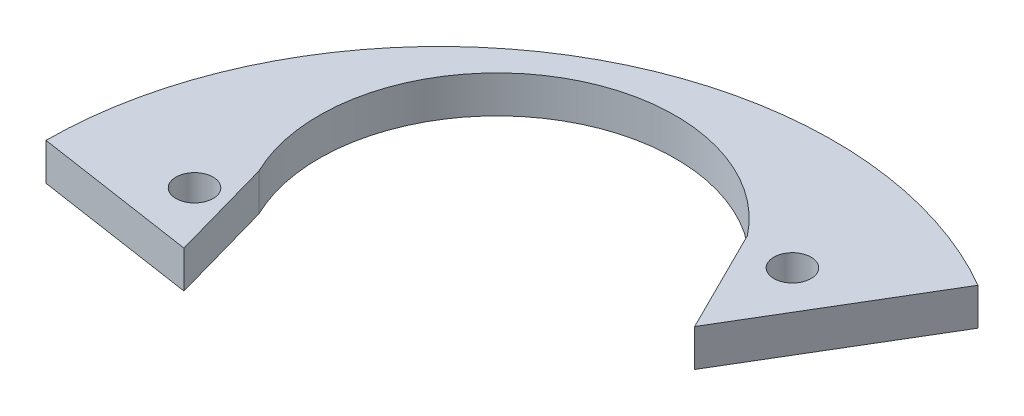
ISO-10303-21;
HEADER;
FILE_DESCRIPTION(('STEP AP214'),'2;1');
FILE_NAME('part.step','',(''),(''),'','','');
FILE_SCHEMA(('AUTOMOTIVE_DESIGN { 1 0 10303 214 1 1 1 1 }'));
ENDSEC;
DATA;
#1=APPLICATION_CONTEXT('core data for automotive mechanical design processes');
#2=APPLICATION_PROTOCOL_DEFINITION('international standard','automotive_design',2000,#1);
#3=PRODUCT_CONTEXT('',#1,'mechanical');
#4=PRODUCT('Part','Part','',(#3));
#5=PRODUCT_RELATED_PRODUCT_CATEGORY('part','',(#4));
#6=PRODUCT_DEFINITION_FORMATION('','',#4);
#7=PRODUCT_DEFINITION_CONTEXT('part definition',#1,'design');
#8=PRODUCT_DEFINITION('design','',#6,#7);
#9=PRODUCT_DEFINITION_SHAPE('','',#8);
#10=(LENGTH_UNIT() NAMED_UNIT(*) SI_UNIT(.MILLI.,.METRE.));
#11=(NAMED_UNIT(*) PLANE_ANGLE_UNIT() SI_UNIT($,.RADIAN.));
#12=(NAMED_UNIT(*) SI_UNIT($,.STERADIAN.) SOLID_ANGLE_UNIT());
#13=UNCERTAINTY_MEASURE_WITH_UNIT(LENGTH_MEASURE(1.E-05),#10,'distance_accuracy_value','');
#14=(GEOMETRIC_REPRESENTATION_CONTEXT(3) GLOBAL_UNCERTAINTY_ASSIGNED_CONTEXT((#13)) GLOBAL_UNIT_ASSIGNED_CONTEXT((#10,
#11,#12)) REPRESENTATION_CONTEXT('',''));
#15=CARTESIAN_POINT('',(0.,0.,0.));
#16=DIRECTION('',(0.,0.,1.));
#17=DIRECTION('',(1.,0.,0.));
#18=AXIS2_PLACEMENT_3D('',#15,#16,#17);
#19=CARTESIAN_POINT('',(-8.98202615056909,3.,4.86257778184173));
#20=DIRECTION('',(0.,-1.,0.));
#21=DIRECTION('',(0.,0.,-1.));
#22=AXIS2_PLACEMENT_3D('',#19,#20,#21);
#23=CYLINDRICAL_SURFACE('',#22,14.3707592623544);
#24=CARTESIAN_POINT('',(-8.98202615056909,0.,4.86257778184173));
#25=DIRECTION('',(0.,1.,0.));
#26=DIRECTION('',(0.,0.,1.));
#27=AXIS2_PLACEMENT_3D('',#24,#25,#26);
#28=CIRCLE('',#27,14.3707592623544);
#29=CARTESIAN_POINT('',(2.3104080282445,0.,-4.02559706419421));
#30=VERTEX_POINT('',#29);
#31=CARTESIAN_POINT('',(-21.9045801751569,0.,11.1495738259118));
#32=VERTEX_POINT('',#31);
#33=EDGE_CURVE('E128',#30,#32,#28,.T.);
#34=ORIENTED_EDGE('',*,*,#33,.F.);
#35=DIRECTION('',(0.,-1.,0.));
#36=VECTOR('',#35,1.);
#37=CARTESIAN_POINT('',(2.3104080282445,3.,-4.02559706419421));
#38=LINE('',#37,#36);
#39=CARTESIAN_POINT('',(2.3104080282445,3.,-4.02559706419421));
#40=VERTEX_POINT('',#39);
#41=EDGE_CURVE('E11',#40,#30,#38,.T.);
#42=ORIENTED_EDGE('',*,*,#41,.F.);
#43=CARTESIAN_POINT('',(-8.98202615056909,3.,4.86257778184173));
#44=DIRECTION('',(0.,1.,0.));
#45=DIRECTION('',(0.,0.,1.));
#46=AXIS2_PLACEMENT_3D('',#43,#44,#45);
#47=CIRCLE('',#46,14.3707592623544);
#48=CARTESIAN_POINT('',(-21.9045801751569,3.,11.1495738259118));
#49=VERTEX_POINT('',#48);
#50=EDGE_CURVE('E185',#40,#49,#47,.T.);
#51=ORIENTED_EDGE('',*,*,#50,.T.);
#52=DIRECTION('',(0.,-1.,0.));
#53=VECTOR('',#52,1.);
#54=CARTESIAN_POINT('',(-21.9045801751569,3.,11.1495738259118));
#55=LINE('',#54,#53);
#56=EDGE_CURVE('E78',#49,#32,#55,.T.);
#57=ORIENTED_EDGE('',*,*,#56,.T.);
#58=EDGE_LOOP('',(#34,#42,#51,#57));
#59=FACE_BOUND('',#58,.T.);
#60=ADVANCED_FACE('F33',(#59),#23,.F.);
#61=CARTESIAN_POINT('',(3.45753328539834,3.,-1.72102092555103));
#62=DIRECTION('',(0.895227963513024,0.,-0.445608452954299));
#63=DIRECTION('',(-0.445608452954299,0.,-0.895227963513024));
#64=AXIS2_PLACEMENT_3D('',#61,#62,#63);
#65=PLANE('',#64);
#66=DIRECTION('',(0.445608452954299,0.,0.895227963513024));
#67=VECTOR('',#66,1.);
#68=CARTESIAN_POINT('',(3.45753328539834,0.,-1.72102092555103));
#69=LINE('',#68,#67);
#70=CARTESIAN_POINT('',(6.53049025433525,0.,4.45255363531279));
#71=VERTEX_POINT('',#70);
#72=EDGE_CURVE('E126',#30,#71,#69,.T.);
#73=ORIENTED_EDGE('',*,*,#72,.T.);
#74=DIRECTION('',(0.,-1.,0.));
#75=VECTOR('',#74,1.);
#76=CARTESIAN_POINT('',(6.53049025433525,3.,4.45255363531279));
#77=LINE('',#76,#75);
#78=CARTESIAN_POINT('',(6.53049025433525,3.,4.45255363531279));
#79=VERTEX_POINT('',#78);
#80=EDGE_CURVE('E42',#79,#71,#77,.T.);
#81=ORIENTED_EDGE('',*,*,#80,.F.);
#82=DIRECTION('',(0.445608452954299,0.,0.895227963513024));
#83=VECTOR('',#82,1.);
#84=CARTESIAN_POINT('',(3.45753328539834,3.,-1.72102092555103));
#85=LINE('',#84,#83);
#86=EDGE_CURVE('E187',#40,#79,#85,.T.);
#87=ORIENTED_EDGE('',*,*,#86,.F.);
#88=ORIENTED_EDGE('',*,*,#41,.T.);
#89=EDGE_LOOP('',(#73,#81,#87,#88));
#90=FACE_BOUND('',#89,.T.);
#91=ADVANCED_FACE('F127',(#90),#65,.F.);
#92=CARTESIAN_POINT('',(6.77463363470462,3.,4.04350726878071));
#93=DIRECTION('',(-0.858680189817032,0.,-0.51251178680669));
#94=DIRECTION('',(-0.51251178680669,0.,0.858680189817032));
#95=AXIS2_PLACEMENT_3D('',#92,#93,#94);
#96=PLANE('',#95);
#97=DIRECTION('',(0.51251178680669,0.,-0.858680189817032));
#98=VECTOR('',#97,1.);
#99=CARTESIAN_POINT('',(6.77463363470462,0.,4.04350726878071));
#100=LINE('',#99,#98);
#101=CARTESIAN_POINT('',(15.0716512701939,0.,-9.85760654276261));
#102=VERTEX_POINT('',#101);
#103=EDGE_CURVE('E123',#71,#102,#100,.T.);
#104=ORIENTED_EDGE('',*,*,#103,.T.);
#105=DIRECTION('',(0.,-1.,0.));
#106=VECTOR('',#105,1.);
#107=CARTESIAN_POINT('',(15.0716512701939,3.,-9.85760654276261));
#108=LINE('',#107,#106);
#109=CARTESIAN_POINT('',(15.0716512701939,3.,-9.85760654276261));
#110=VERTEX_POINT('',#109);
#111=EDGE_CURVE('E112',#110,#102,#108,.T.);
#112=ORIENTED_EDGE('',*,*,#111,.F.);
#113=DIRECTION('',(0.51251178680669,0.,-0.858680189817032));
#114=VECTOR('',#113,1.);
#115=CARTESIAN_POINT('',(6.77463363470462,3.,4.04350726878071));
#116=LINE('',#115,#114);
#117=EDGE_CURVE('E105',#79,#110,#116,.T.);
#118=ORIENTED_EDGE('',*,*,#117,.F.);
#119=ORIENTED_EDGE('',*,*,#80,.T.);
#120=EDGE_LOOP('',(#104,#112,#118,#119));
#121=FACE_BOUND('',#120,.T.);
#122=ADVANCED_FACE('F122',(#121),#96,.F.);
#123=CARTESIAN_POINT('',(-0.843833900325419,3.,17.6498892611962));
#124=DIRECTION('',(0.,-1.,0.));
#125=DIRECTION('',(0.,0.,-1.));
#126=AXIS2_PLACEMENT_3D('',#123,#124,#125);
#127=CYLINDRICAL_SURFACE('',#126,31.7799464067804);
#128=CARTESIAN_POINT('',(-0.843833900325419,0.,17.6498892611962));
#129=DIRECTION('',(0.,1.,0.));
#130=DIRECTION('',(0.,0.,1.));
#131=AXIS2_PLACEMENT_3D('',#128,#129,#130);
#132=CIRCLE('',#131,31.7799464067804);
#133=CARTESIAN_POINT('',(-32.6237448593548,0.,17.602422915264));
#134=VERTEX_POINT('',#133);
#135=EDGE_CURVE('E111',#102,#134,#132,.T.);
#136=ORIENTED_EDGE('',*,*,#135,.T.);
#137=DIRECTION('',(0.,-1.,0.));
#138=VECTOR('',#137,1.);
#139=CARTESIAN_POINT('',(-32.6237448593548,3.,17.602422915264));
#140=LINE('',#139,#138);
#141=CARTESIAN_POINT('',(-32.6237448593548,3.,17.602422915264));
#142=VERTEX_POINT('',#141);
#143=EDGE_CURVE('E97',#142,#134,#140,.T.);
#144=ORIENTED_EDGE('',*,*,#143,.F.);
#145=CARTESIAN_POINT('',(-0.843833900325419,3.,17.6498892611962));
#146=DIRECTION('',(0.,1.,0.));
#147=DIRECTION('',(0.,0.,1.));
#148=AXIS2_PLACEMENT_3D('',#145,#146,#147);
#149=CIRCLE('',#148,31.7799464067804);
#150=EDGE_CURVE('E100',#110,#142,#149,.T.);
#151=ORIENTED_EDGE('',*,*,#150,.F.);
#152=ORIENTED_EDGE('',*,*,#111,.T.);
#153=EDGE_LOOP('',(#136,#144,#151,#152));
#154=FACE_BOUND('',#153,.T.);
#155=ADVANCED_FACE('F110',(#154),#127,.T.);
#156=CARTESIAN_POINT('',(-3.29976649273267,3.,22.0005903964211));
#157=DIRECTION('',(0.148326294407169,0.,-0.988938476543125));
#158=DIRECTION('',(-0.988938476543125,0.,-0.148326294407169));
#159=AXIS2_PLACEMENT_3D('',#156,#157,#158);
#160=PLANE('',#159);
#161=DIRECTION('',(0.988938476543125,0.,0.148326294407169));
#162=VECTOR('',#161,1.);
#163=CARTESIAN_POINT('',(-3.29976649273267,0.,22.0005903964211));
#164=LINE('',#163,#162);
#165=CARTESIAN_POINT('',(-19.5376969288378,0.,19.5651385381337));
#166=VERTEX_POINT('',#165);
#167=EDGE_CURVE('E136',#134,#166,#164,.T.);
#168=ORIENTED_EDGE('',*,*,#167,.T.);
#169=DIRECTION('',(0.,-1.,0.));
#170=VECTOR('',#169,1.);
#171=CARTESIAN_POINT('',(-19.5376969288378,3.,19.5651385381337));
#172=LINE('',#171,#170);
#173=CARTESIAN_POINT('',(-19.5376969288378,3.,19.5651385381337));
#174=VERTEX_POINT('',#173);
#175=EDGE_CURVE('E99',#174,#166,#172,.T.);
#176=ORIENTED_EDGE('',*,*,#175,.F.);
#177=DIRECTION('',(0.988938476543125,0.,0.148326294407169));
#178=VECTOR('',#177,1.);
#179=CARTESIAN_POINT('',(-3.29976649273267,3.,22.0005903964211));
#180=LINE('',#179,#178);
#181=EDGE_CURVE('E92',#142,#174,#180,.T.);
#182=ORIENTED_EDGE('',*,*,#181,.F.);
#183=ORIENTED_EDGE('',*,*,#143,.T.);
#184=EDGE_LOOP('',(#168,#176,#182,#183));
#185=FACE_BOUND('',#184,.T.);
#186=ADVANCED_FACE('F95',(#185),#160,.F.);
#187=CARTESIAN_POINT('',(6.37723860788613,3.,-3.59076726195757));
#188=DIRECTION('',(0.,-1.,0.));
#189=DIRECTION('',(0.,0.,-1.));
#190=AXIS2_PLACEMENT_3D('',#187,#188,#189);
#191=CYLINDRICAL_SURFACE('',#190,1.5);
#192=CARTESIAN_POINT('',(6.37723860788613,3.,-3.59076726195757));
#193=DIRECTION('',(0.,1.,0.));
#194=DIRECTION('',(0.,0.,1.));
#195=AXIS2_PLACEMENT_3D('',#192,#193,#194);
#196=CIRCLE('',#195,1.5);
#197=CARTESIAN_POINT('',(6.37723860788613,3.,-2.09076726195757));
#198=VERTEX_POINT('',#197);
#199=EDGE_CURVE('E184',#198,#198,#196,.T.);
#200=ORIENTED_EDGE('',*,*,#199,.T.);
#201=EDGE_LOOP('',(#200));
#202=FACE_BOUND('',#201,.T.);
#203=CARTESIAN_POINT('',(6.37723860788613,0.,-3.59076726195757));
#204=DIRECTION('',(0.,1.,0.));
#205=DIRECTION('',(0.,0.,1.));
#206=AXIS2_PLACEMENT_3D('',#203,#204,#205);
#207=CIRCLE('',#206,1.5);
#208=CARTESIAN_POINT('',(6.37723860788613,0.,-2.09076726195757));
#209=VERTEX_POINT('',#208);
#210=EDGE_CURVE('E131',#209,#209,#207,.T.);
#211=ORIENTED_EDGE('',*,*,#210,.F.);
#212=EDGE_LOOP('',(#211));
#213=FACE_BOUND('',#212,.T.);
#214=ADVANCED_FACE('F148',(#202,#213),#191,.F.);
#215=CARTESIAN_POINT('',(-23.3218008385222,3.,14.928602488676));
#216=DIRECTION('',(0.,-1.,0.));
#217=DIRECTION('',(0.,0.,-1.));
#218=AXIS2_PLACEMENT_3D('',#215,#216,#217);
#219=CYLINDRICAL_SURFACE('',#218,1.5);
#220=CARTESIAN_POINT('',(-23.3218008385222,3.,14.928602488676));
#221=DIRECTION('',(0.,1.,0.));
#222=DIRECTION('',(0.,0.,1.));
#223=AXIS2_PLACEMENT_3D('',#220,#221,#222);
#224=CIRCLE('',#223,1.5);
#225=CARTESIAN_POINT('',(-23.3218008385222,3.,16.428602488676));
#226=VERTEX_POINT('',#225);
#227=EDGE_CURVE('E138',#226,#226,#224,.T.);
#228=ORIENTED_EDGE('',*,*,#227,.T.);
#229=EDGE_LOOP('',(#228));
#230=FACE_BOUND('',#229,.T.);
#231=CARTESIAN_POINT('',(-23.3218008385222,0.,14.928602488676));
#232=DIRECTION('',(0.,1.,0.));
#233=DIRECTION('',(0.,0.,1.));
#234=AXIS2_PLACEMENT_3D('',#231,#232,#233);
#235=CIRCLE('',#234,1.5);
#236=CARTESIAN_POINT('',(-23.3218008385222,0.,16.428602488676));
#237=VERTEX_POINT('',#236);
#238=EDGE_CURVE('E141',#237,#237,#235,.T.);
#239=ORIENTED_EDGE('',*,*,#238,.F.);
#240=EDGE_LOOP('',(#239));
#241=FACE_BOUND('',#240,.T.);
#242=ADVANCED_FACE('F35',(#230,#241),#219,.F.);
#243=CARTESIAN_POINT('',(-23.2048561519907,3.,6.52638142983173));
#244=DIRECTION('',(-0.962650771080083,0.,0.270746178068908));
#245=DIRECTION('',(0.270746178068908,0.,0.962650771080084));
#246=AXIS2_PLACEMENT_3D('',#243,#244,#245);
#247=PLANE('',#246);
#248=DIRECTION('',(-0.270746178068908,0.,-0.962650771080084));
#249=VECTOR('',#248,1.);
#250=CARTESIAN_POINT('',(-23.2048561519907,0.,6.52638142983173));
#251=LINE('',#250,#249);
#252=EDGE_CURVE('E71',#166,#32,#251,.T.);
#253=ORIENTED_EDGE('',*,*,#252,.T.);
#254=ORIENTED_EDGE('',*,*,#56,.F.);
#255=DIRECTION('',(-0.270746178068908,0.,-0.962650771080084));
#256=VECTOR('',#255,1.);
#257=CARTESIAN_POINT('',(-23.2048561519907,3.,6.52638142983173));
#258=LINE('',#257,#256);
#259=EDGE_CURVE('E50',#174,#49,#258,.T.);
#260=ORIENTED_EDGE('',*,*,#259,.F.);
#261=ORIENTED_EDGE('',*,*,#175,.T.);
#262=EDGE_LOOP('',(#253,#254,#260,#261));
#263=FACE_BOUND('',#262,.T.);
#264=ADVANCED_FACE('F155',(#263),#247,.F.);
#265=CARTESIAN_POINT('',(0.,3.,0.));
#266=DIRECTION('',(0.,1.,0.));
#267=DIRECTION('',(0.,0.,1.));
#268=AXIS2_PLACEMENT_3D('',#265,#266,#267);
#269=PLANE('',#268);
#270=ORIENTED_EDGE('',*,*,#227,.F.);
#271=EDGE_LOOP('',(#270));
#272=FACE_BOUND('',#271,.T.);
#273=ORIENTED_EDGE('',*,*,#199,.F.);
#274=EDGE_LOOP('',(#273));
#275=FACE_BOUND('',#274,.T.);
#276=ORIENTED_EDGE('',*,*,#50,.F.);
#277=ORIENTED_EDGE('',*,*,#86,.T.);
#278=ORIENTED_EDGE('',*,*,#117,.T.);
#279=ORIENTED_EDGE('',*,*,#150,.T.);
#280=ORIENTED_EDGE('',*,*,#181,.T.);
#281=ORIENTED_EDGE('',*,*,#259,.T.);
#282=EDGE_LOOP('',(#276,#277,#278,#279,#280,#281));
#283=FACE_BOUND('',#282,.T.);
#284=ADVANCED_FACE('F103',(#272,#275,#283),#269,.T.);
#285=CARTESIAN_POINT('',(0.,0.,0.));
#286=DIRECTION('',(0.,1.,0.));
#287=DIRECTION('',(0.,0.,1.));
#288=AXIS2_PLACEMENT_3D('',#285,#286,#287);
#289=PLANE('',#288);
#290=ORIENTED_EDGE('',*,*,#238,.T.);
#291=EDGE_LOOP('',(#290));
#292=FACE_BOUND('',#291,.T.);
#293=ORIENTED_EDGE('',*,*,#210,.T.);
#294=EDGE_LOOP('',(#293));
#295=FACE_BOUND('',#294,.T.);
#296=ORIENTED_EDGE('',*,*,#33,.T.);
#297=ORIENTED_EDGE('',*,*,#252,.F.);
#298=ORIENTED_EDGE('',*,*,#167,.F.);
#299=ORIENTED_EDGE('',*,*,#135,.F.);
#300=ORIENTED_EDGE('',*,*,#103,.F.);
#301=ORIENTED_EDGE('',*,*,#72,.F.);
#302=EDGE_LOOP('',(#296,#297,#298,#299,#300,#301));
#303=FACE_BOUND('',#302,.T.);
#304=ADVANCED_FACE('F146',(#292,#295,#303),#289,.F.);
#305=CLOSED_SHELL('',(#60,#91,#122,#155,#186,#214,#242,#264,#284,#304));
#306=MANIFOLD_SOLID_BREP('B2',#305);
#307=ADVANCED_BREP_SHAPE_REPRESENTATION('',(#18,#306),#14);
#308=SHAPE_DEFINITION_REPRESENTATION(#9,#307);
ENDSEC;
END-ISO-10303-21;
